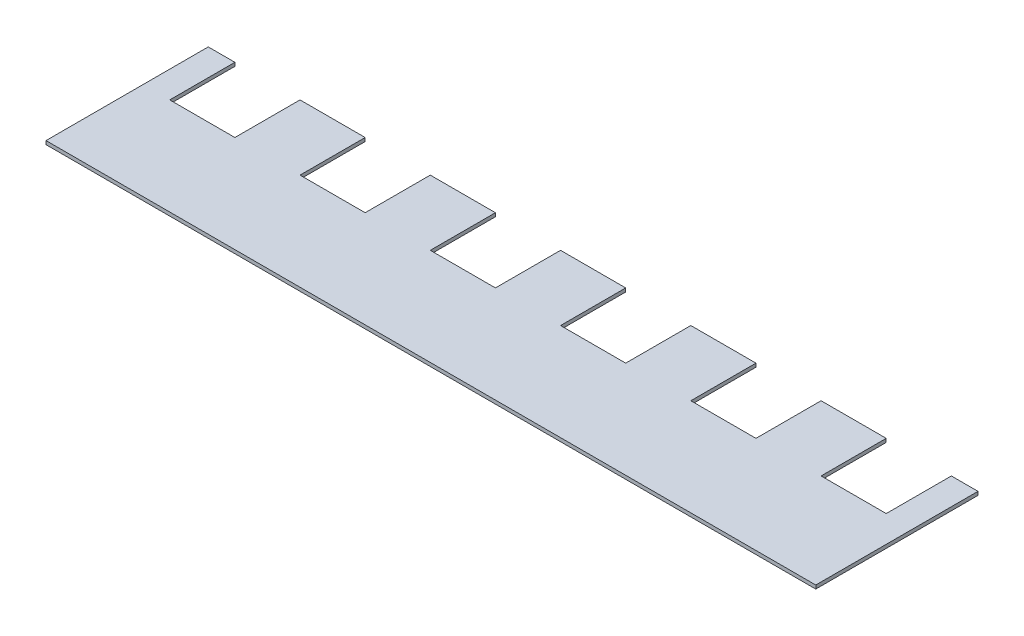
ISO-10303-21;
HEADER;
FILE_DESCRIPTION(('STEP AP214'),'2;1');
FILE_NAME('part.step','',(''),(''),'','','');
FILE_SCHEMA(('AUTOMOTIVE_DESIGN { 1 0 10303 214 1 1 1 1 }'));
ENDSEC;
DATA;
#1=APPLICATION_CONTEXT('core data for automotive mechanical design processes');
#2=APPLICATION_PROTOCOL_DEFINITION('international standard','automotive_design',2000,#1);
#3=PRODUCT_CONTEXT('',#1,'mechanical');
#4=PRODUCT('Part','Part','',(#3));
#5=PRODUCT_RELATED_PRODUCT_CATEGORY('part','',(#4));
#6=PRODUCT_DEFINITION_FORMATION('','',#4);
#7=PRODUCT_DEFINITION_CONTEXT('part definition',#1,'design');
#8=PRODUCT_DEFINITION('design','',#6,#7);
#9=PRODUCT_DEFINITION_SHAPE('','',#8);
#10=(LENGTH_UNIT() NAMED_UNIT(*) SI_UNIT(.MILLI.,.METRE.));
#11=(NAMED_UNIT(*) PLANE_ANGLE_UNIT() SI_UNIT($,.RADIAN.));
#12=(NAMED_UNIT(*) SI_UNIT($,.STERADIAN.) SOLID_ANGLE_UNIT());
#13=UNCERTAINTY_MEASURE_WITH_UNIT(LENGTH_MEASURE(1.E-05),#10,'distance_accuracy_value','');
#14=(GEOMETRIC_REPRESENTATION_CONTEXT(3) GLOBAL_UNCERTAINTY_ASSIGNED_CONTEXT((#13)) GLOBAL_UNIT_ASSIGNED_CONTEXT((#10,
#11,#12)) REPRESENTATION_CONTEXT('',''));
#15=CARTESIAN_POINT('',(0.,0.,0.));
#16=DIRECTION('',(0.,0.,1.));
#17=DIRECTION('',(1.,0.,0.));
#18=AXIS2_PLACEMENT_3D('',#15,#16,#17);
#19=CARTESIAN_POINT('',(-62.5126849362151,3.,-109.983119557904));
#20=DIRECTION('',(0.,0.,-1.));
#21=DIRECTION('',(-1.,0.,0.));
#22=AXIS2_PLACEMENT_3D('',#19,#20,#21);
#23=PLANE('',#22);
#24=DIRECTION('',(0.,1.,0.));
#25=VECTOR('',#24,1.);
#26=CARTESIAN_POINT('',(-40.0126849362151,0.,-109.983119557904));
#27=LINE('',#26,#25);
#28=CARTESIAN_POINT('',(-40.0126849362151,0.,-109.983119557904));
#29=VERTEX_POINT('',#28);
#30=CARTESIAN_POINT('',(-40.0126849362151,3.,-109.983119557904));
#31=VERTEX_POINT('',#30);
#32=EDGE_CURVE('E248',#29,#31,#27,.T.);
#33=ORIENTED_EDGE('',*,*,#32,.F.);
#34=DIRECTION('',(1.,0.,0.));
#35=VECTOR('',#34,1.);
#36=CARTESIAN_POINT('',(-62.5126849362151,0.,-109.983119557904));
#37=LINE('',#36,#35);
#38=CARTESIAN_POINT('',(-62.5126849362151,0.,-109.983119557904));
#39=VERTEX_POINT('',#38);
#40=EDGE_CURVE('E239',#39,#29,#37,.T.);
#41=ORIENTED_EDGE('',*,*,#40,.F.);
#42=DIRECTION('',(0.,-1.,0.));
#43=VECTOR('',#42,1.);
#44=CARTESIAN_POINT('',(-62.5126849362151,3.,-109.983119557904));
#45=LINE('',#44,#43);
#46=CARTESIAN_POINT('',(-62.5126849362151,3.,-109.983119557904));
#47=VERTEX_POINT('',#46);
#48=EDGE_CURVE('E356',#47,#39,#45,.T.);
#49=ORIENTED_EDGE('',*,*,#48,.F.);
#50=DIRECTION('',(1.,0.,0.));
#51=VECTOR('',#50,1.);
#52=CARTESIAN_POINT('',(-62.5126849362151,3.,-109.983119557904));
#53=LINE('',#52,#51);
#54=EDGE_CURVE('E353',#47,#31,#53,.T.);
#55=ORIENTED_EDGE('',*,*,#54,.T.);
#56=EDGE_LOOP('',(#33,#41,#49,#55));
#57=FACE_BOUND('',#56,.T.);
#58=ADVANCED_FACE('F33',(#57),#23,.T.);
#59=CARTESIAN_POINT('',(454.987315063785,0.,-109.983119557904));
#60=VERTEX_POINT('',#59);
#61=CARTESIAN_POINT('',(509.987315063785,0.,-109.983119557904));
#62=VERTEX_POINT('',#61);
#63=EDGE_CURVE('E442',#60,#62,#37,.T.);
#64=ORIENTED_EDGE('',*,*,#63,.F.);
#65=DIRECTION('',(0.,1.,0.));
#66=VECTOR('',#65,1.);
#67=CARTESIAN_POINT('',(454.987315063785,-1.2E-05,-109.983119557904));
#68=LINE('',#67,#66);
#69=CARTESIAN_POINT('',(454.987315063785,3.,-109.983119557904));
#70=VERTEX_POINT('',#69);
#71=EDGE_CURVE('E316',#60,#70,#68,.T.);
#72=ORIENTED_EDGE('',*,*,#71,.T.);
#73=CARTESIAN_POINT('',(509.987315063785,3.,-109.983119557904));
#74=VERTEX_POINT('',#73);
#75=EDGE_CURVE('E438',#70,#74,#53,.T.);
#76=ORIENTED_EDGE('',*,*,#75,.T.);
#77=DIRECTION('',(0.,1.,0.));
#78=VECTOR('',#77,1.);
#79=CARTESIAN_POINT('',(509.987315063785,-1.2E-05,-109.983119557904));
#80=LINE('',#79,#78);
#81=EDGE_CURVE('E302',#62,#74,#80,.T.);
#82=ORIENTED_EDGE('',*,*,#81,.F.);
#83=EDGE_LOOP('',(#64,#72,#76,#82));
#84=FACE_BOUND('',#83,.T.);
#85=ADVANCED_FACE('F440',(#84),#23,.T.);
#86=CARTESIAN_POINT('',(564.987315063785,0.,-109.983119557904));
#87=VERTEX_POINT('',#86);
#88=CARTESIAN_POINT('',(587.487315063785,0.,-109.983119557904));
#89=VERTEX_POINT('',#88);
#90=EDGE_CURVE('E367',#87,#89,#37,.T.);
#91=ORIENTED_EDGE('',*,*,#90,.F.);
#92=DIRECTION('',(0.,1.,0.));
#93=VECTOR('',#92,1.);
#94=CARTESIAN_POINT('',(564.987315063785,-1.2E-05,-109.983119557904));
#95=LINE('',#94,#93);
#96=CARTESIAN_POINT('',(564.987315063785,3.,-109.983119557904));
#97=VERTEX_POINT('',#96);
#98=EDGE_CURVE('E299',#87,#97,#95,.T.);
#99=ORIENTED_EDGE('',*,*,#98,.T.);
#100=CARTESIAN_POINT('',(587.487315063785,3.,-109.983119557904));
#101=VERTEX_POINT('',#100);
#102=EDGE_CURVE('E352',#97,#101,#53,.T.);
#103=ORIENTED_EDGE('',*,*,#102,.T.);
#104=DIRECTION('',(0.,-1.,0.));
#105=VECTOR('',#104,1.);
#106=CARTESIAN_POINT('',(587.487315063785,3.,-109.983119557904));
#107=LINE('',#106,#105);
#108=EDGE_CURVE('E372',#101,#89,#107,.T.);
#109=ORIENTED_EDGE('',*,*,#108,.T.);
#110=EDGE_LOOP('',(#91,#99,#103,#109));
#111=FACE_BOUND('',#110,.T.);
#112=ADVANCED_FACE('F512',(#111),#23,.T.);
#113=CARTESIAN_POINT('',(124.987315063785,0.,-109.983119557904));
#114=VERTEX_POINT('',#113);
#115=CARTESIAN_POINT('',(179.987315063785,0.,-109.983119557904));
#116=VERTEX_POINT('',#115);
#117=EDGE_CURVE('E370',#114,#116,#37,.T.);
#118=ORIENTED_EDGE('',*,*,#117,.F.);
#119=DIRECTION('',(0.,1.,0.));
#120=VECTOR('',#119,1.);
#121=CARTESIAN_POINT('',(124.987315063785,-1.2E-05,-109.983119557904));
#122=LINE('',#121,#120);
#123=CARTESIAN_POINT('',(124.987315063785,3.,-109.983119557904));
#124=VERTEX_POINT('',#123);
#125=EDGE_CURVE('E280',#114,#124,#122,.T.);
#126=ORIENTED_EDGE('',*,*,#125,.T.);
#127=CARTESIAN_POINT('',(179.987315063785,3.,-109.983119557904));
#128=VERTEX_POINT('',#127);
#129=EDGE_CURVE('E358',#124,#128,#53,.T.);
#130=ORIENTED_EDGE('',*,*,#129,.T.);
#131=DIRECTION('',(0.,1.,0.));
#132=VECTOR('',#131,1.);
#133=CARTESIAN_POINT('',(179.987315063785,-1.2E-05,-109.983119557904));
#134=LINE('',#133,#132);
#135=EDGE_CURVE('E263',#116,#128,#134,.T.);
#136=ORIENTED_EDGE('',*,*,#135,.F.);
#137=EDGE_LOOP('',(#118,#126,#130,#136));
#138=FACE_BOUND('',#137,.T.);
#139=ADVANCED_FACE('F484',(#138),#23,.T.);
#140=CARTESIAN_POINT('',(234.987315063785,0.,-109.983119557904));
#141=VERTEX_POINT('',#140);
#142=CARTESIAN_POINT('',(289.987315063785,0.,-109.983119557904));
#143=VERTEX_POINT('',#142);
#144=EDGE_CURVE('E444',#141,#143,#37,.T.);
#145=ORIENTED_EDGE('',*,*,#144,.F.);
#146=DIRECTION('',(0.,1.,0.));
#147=VECTOR('',#146,1.);
#148=CARTESIAN_POINT('',(234.987315063785,-1.2E-05,-109.983119557904));
#149=LINE('',#148,#147);
#150=CARTESIAN_POINT('',(234.987315063785,3.,-109.983119557904));
#151=VERTEX_POINT('',#150);
#152=EDGE_CURVE('E260',#141,#151,#149,.T.);
#153=ORIENTED_EDGE('',*,*,#152,.T.);
#154=CARTESIAN_POINT('',(289.987315063785,3.,-109.983119557904));
#155=VERTEX_POINT('',#154);
#156=EDGE_CURVE('E460',#151,#155,#53,.T.);
#157=ORIENTED_EDGE('',*,*,#156,.T.);
#158=DIRECTION('',(0.,1.,0.));
#159=VECTOR('',#158,1.);
#160=CARTESIAN_POINT('',(289.987315063785,-1.2E-05,-109.983119557904));
#161=LINE('',#160,#159);
#162=EDGE_CURVE('E335',#143,#155,#161,.T.);
#163=ORIENTED_EDGE('',*,*,#162,.F.);
#164=EDGE_LOOP('',(#145,#153,#157,#163));
#165=FACE_BOUND('',#164,.T.);
#166=ADVANCED_FACE('F457',(#165),#23,.T.);
#167=DIRECTION('',(0.,1.,0.));
#168=VECTOR('',#167,1.);
#169=CARTESIAN_POINT('',(399.987315063785,-1.2E-05,-109.983119557904));
#170=LINE('',#169,#168);
#171=CARTESIAN_POINT('',(399.987315063785,0.,-109.983119557904));
#172=VERTEX_POINT('',#171);
#173=CARTESIAN_POINT('',(399.987315063785,3.,-109.983119557904));
#174=VERTEX_POINT('',#173);
#175=EDGE_CURVE('E250',#172,#174,#170,.T.);
#176=ORIENTED_EDGE('',*,*,#175,.F.);
#177=CARTESIAN_POINT('',(344.987315063785,0.,-109.983119557904));
#178=VERTEX_POINT('',#177);
#179=EDGE_CURVE('E443',#178,#172,#37,.T.);
#180=ORIENTED_EDGE('',*,*,#179,.F.);
#181=DIRECTION('',(0.,1.,0.));
#182=VECTOR('',#181,1.);
#183=CARTESIAN_POINT('',(344.987315063785,-1.2E-05,-109.983119557904));
#184=LINE('',#183,#182);
#185=CARTESIAN_POINT('',(344.987315063785,3.,-109.983119557904));
#186=VERTEX_POINT('',#185);
#187=EDGE_CURVE('E338',#178,#186,#184,.T.);
#188=ORIENTED_EDGE('',*,*,#187,.T.);
#189=EDGE_CURVE('E473',#186,#174,#53,.T.);
#190=ORIENTED_EDGE('',*,*,#189,.T.);
#191=EDGE_LOOP('',(#176,#180,#188,#190));
#192=FACE_BOUND('',#191,.T.);
#193=ADVANCED_FACE('F472',(#192),#23,.T.);
#194=CARTESIAN_POINT('',(-62.5126849362151,3.,-109.983119557904));
#195=DIRECTION('',(1.,0.,0.));
#196=DIRECTION('',(0.,0.,-1.));
#197=AXIS2_PLACEMENT_3D('',#194,#195,#196);
#198=PLANE('',#197);
#199=DIRECTION('',(0.,0.,1.));
#200=VECTOR('',#199,1.);
#201=CARTESIAN_POINT('',(-62.5126849362151,0.,-109.983119557904));
#202=LINE('',#201,#200);
#203=CARTESIAN_POINT('',(-62.5126849362151,0.,27.016880442096));
#204=VERTEX_POINT('',#203);
#205=EDGE_CURVE('E337',#39,#204,#202,.T.);
#206=ORIENTED_EDGE('',*,*,#205,.T.);
#207=DIRECTION('',(0.,-1.,0.));
#208=VECTOR('',#207,1.);
#209=CARTESIAN_POINT('',(-62.5126849362151,3.,27.016880442096));
#210=LINE('',#209,#208);
#211=CARTESIAN_POINT('',(-62.5126849362151,3.,27.016880442096));
#212=VERTEX_POINT('',#211);
#213=EDGE_CURVE('E377',#212,#204,#210,.T.);
#214=ORIENTED_EDGE('',*,*,#213,.F.);
#215=DIRECTION('',(0.,0.,1.));
#216=VECTOR('',#215,1.);
#217=CARTESIAN_POINT('',(-62.5126849362151,3.,-109.983119557904));
#218=LINE('',#217,#216);
#219=EDGE_CURVE('E344',#47,#212,#218,.T.);
#220=ORIENTED_EDGE('',*,*,#219,.F.);
#221=ORIENTED_EDGE('',*,*,#48,.T.);
#222=EDGE_LOOP('',(#206,#214,#220,#221));
#223=FACE_BOUND('',#222,.T.);
#224=ADVANCED_FACE('F35',(#223),#198,.F.);
#225=CARTESIAN_POINT('',(-62.5126849362151,3.,27.016880442096));
#226=DIRECTION('',(0.,0.,-1.));
#227=DIRECTION('',(-1.,0.,0.));
#228=AXIS2_PLACEMENT_3D('',#225,#226,#227);
#229=PLANE('',#228);
#230=DIRECTION('',(1.,0.,0.));
#231=VECTOR('',#230,1.);
#232=CARTESIAN_POINT('',(-62.5126849362151,0.,27.016880442096));
#233=LINE('',#232,#231);
#234=CARTESIAN_POINT('',(587.487315063785,0.,27.016880442096));
#235=VERTEX_POINT('',#234);
#236=EDGE_CURVE('E361',#204,#235,#233,.T.);
#237=ORIENTED_EDGE('',*,*,#236,.T.);
#238=DIRECTION('',(0.,-1.,0.));
#239=VECTOR('',#238,1.);
#240=CARTESIAN_POINT('',(587.487315063785,3.,27.016880442096));
#241=LINE('',#240,#239);
#242=CARTESIAN_POINT('',(587.487315063785,3.,27.016880442096));
#243=VERTEX_POINT('',#242);
#244=EDGE_CURVE('E375',#243,#235,#241,.T.);
#245=ORIENTED_EDGE('',*,*,#244,.F.);
#246=DIRECTION('',(1.,0.,0.));
#247=VECTOR('',#246,1.);
#248=CARTESIAN_POINT('',(-62.5126849362151,3.,27.016880442096));
#249=LINE('',#248,#247);
#250=EDGE_CURVE('E347',#212,#243,#249,.T.);
#251=ORIENTED_EDGE('',*,*,#250,.F.);
#252=ORIENTED_EDGE('',*,*,#213,.T.);
#253=EDGE_LOOP('',(#237,#245,#251,#252));
#254=FACE_BOUND('',#253,.T.);
#255=ADVANCED_FACE('F522',(#254),#229,.F.);
#256=CARTESIAN_POINT('',(587.487315063785,3.,-109.983119557904));
#257=DIRECTION('',(1.,0.,0.));
#258=DIRECTION('',(0.,0.,-1.));
#259=AXIS2_PLACEMENT_3D('',#256,#257,#258);
#260=PLANE('',#259);
#261=DIRECTION('',(0.,0.,1.));
#262=VECTOR('',#261,1.);
#263=CARTESIAN_POINT('',(587.487315063785,0.,-109.983119557904));
#264=LINE('',#263,#262);
#265=EDGE_CURVE('E364',#89,#235,#264,.T.);
#266=ORIENTED_EDGE('',*,*,#265,.F.);
#267=ORIENTED_EDGE('',*,*,#108,.F.);
#268=DIRECTION('',(0.,0.,1.));
#269=VECTOR('',#268,1.);
#270=CARTESIAN_POINT('',(587.487315063785,3.,-109.983119557904));
#271=LINE('',#270,#269);
#272=EDGE_CURVE('E349',#101,#243,#271,.T.);
#273=ORIENTED_EDGE('',*,*,#272,.T.);
#274=ORIENTED_EDGE('',*,*,#244,.T.);
#275=EDGE_LOOP('',(#266,#267,#273,#274));
#276=FACE_BOUND('',#275,.T.);
#277=ADVANCED_FACE('F516',(#276),#260,.T.);
#278=DIRECTION('',(0.,1.,0.));
#279=VECTOR('',#278,1.);
#280=CARTESIAN_POINT('',(14.9873150637849,0.,-109.983119557904));
#281=LINE('',#280,#279);
#282=CARTESIAN_POINT('',(14.9873150637849,0.,-109.983119557904));
#283=VERTEX_POINT('',#282);
#284=CARTESIAN_POINT('',(14.9873150637849,3.,-109.983119557904));
#285=VERTEX_POINT('',#284);
#286=EDGE_CURVE('E251',#283,#285,#281,.T.);
#287=ORIENTED_EDGE('',*,*,#286,.T.);
#288=CARTESIAN_POINT('',(69.9873150637849,3.,-109.983119557904));
#289=VERTEX_POINT('',#288);
#290=EDGE_CURVE('E357',#285,#289,#53,.T.);
#291=ORIENTED_EDGE('',*,*,#290,.T.);
#292=DIRECTION('',(0.,1.,0.));
#293=VECTOR('',#292,1.);
#294=CARTESIAN_POINT('',(69.9873150637849,-1.2E-05,-109.983119557904));
#295=LINE('',#294,#293);
#296=CARTESIAN_POINT('',(69.9873150637849,0.,-109.983119557904));
#297=VERTEX_POINT('',#296);
#298=EDGE_CURVE('E283',#297,#289,#295,.T.);
#299=ORIENTED_EDGE('',*,*,#298,.F.);
#300=EDGE_CURVE('E369',#283,#297,#37,.T.);
#301=ORIENTED_EDGE('',*,*,#300,.F.);
#302=EDGE_LOOP('',(#287,#291,#299,#301));
#303=FACE_BOUND('',#302,.T.);
#304=ADVANCED_FACE('F508',(#303),#23,.T.);
#305=CARTESIAN_POINT('',(0.,3.,0.));
#306=DIRECTION('',(0.,1.,0.));
#307=DIRECTION('',(0.,0.,1.));
#308=AXIS2_PLACEMENT_3D('',#305,#306,#307);
#309=PLANE('',#308);
#310=DIRECTION('',(0.,0.,1.));
#311=VECTOR('',#310,1.);
#312=CARTESIAN_POINT('',(-40.0126849362151,3.,-109.983119557904));
#313=LINE('',#312,#311);
#314=CARTESIAN_POINT('',(-40.0126849362151,3.,-54.983119557904));
#315=VERTEX_POINT('',#314);
#316=EDGE_CURVE('E224',#31,#315,#313,.T.);
#317=ORIENTED_EDGE('',*,*,#316,.F.);
#318=ORIENTED_EDGE('',*,*,#54,.F.);
#319=ORIENTED_EDGE('',*,*,#219,.T.);
#320=ORIENTED_EDGE('',*,*,#250,.T.);
#321=ORIENTED_EDGE('',*,*,#272,.F.);
#322=ORIENTED_EDGE('',*,*,#102,.F.);
#323=DIRECTION('',(0.,0.,1.));
#324=VECTOR('',#323,1.);
#325=CARTESIAN_POINT('',(564.987315063785,3.,-109.983119557904));
#326=LINE('',#325,#324);
#327=CARTESIAN_POINT('',(564.987315063785,3.,-54.983119557904));
#328=VERTEX_POINT('',#327);
#329=EDGE_CURVE('E296',#97,#328,#326,.T.);
#330=ORIENTED_EDGE('',*,*,#329,.T.);
#331=DIRECTION('',(1.,0.,0.));
#332=VECTOR('',#331,1.);
#333=CARTESIAN_POINT('',(509.987315063785,3.,-54.983119557904));
#334=LINE('',#333,#332);
#335=CARTESIAN_POINT('',(509.987315063785,3.,-54.983119557904));
#336=VERTEX_POINT('',#335);
#337=EDGE_CURVE('E307',#336,#328,#334,.T.);
#338=ORIENTED_EDGE('',*,*,#337,.F.);
#339=DIRECTION('',(0.,0.,1.));
#340=VECTOR('',#339,1.);
#341=CARTESIAN_POINT('',(509.987315063785,3.,-109.983119557904));
#342=LINE('',#341,#340);
#343=EDGE_CURVE('E286',#74,#336,#342,.T.);
#344=ORIENTED_EDGE('',*,*,#343,.F.);
#345=ORIENTED_EDGE('',*,*,#75,.F.);
#346=DIRECTION('',(0.,0.,1.));
#347=VECTOR('',#346,1.);
#348=CARTESIAN_POINT('',(454.987315063785,3.,-109.983119557904));
#349=LINE('',#348,#347);
#350=CARTESIAN_POINT('',(454.987315063785,3.,-54.983119557904));
#351=VERTEX_POINT('',#350);
#352=EDGE_CURVE('E314',#70,#351,#349,.T.);
#353=ORIENTED_EDGE('',*,*,#352,.T.);
#354=DIRECTION('',(1.,0.,0.));
#355=VECTOR('',#354,1.);
#356=CARTESIAN_POINT('',(399.987315063785,3.,-54.983119557904));
#357=LINE('',#356,#355);
#358=CARTESIAN_POINT('',(399.987315063785,3.,-54.983119557904));
#359=VERTEX_POINT('',#358);
#360=EDGE_CURVE('E322',#359,#351,#357,.T.);
#361=ORIENTED_EDGE('',*,*,#360,.F.);
#362=DIRECTION('',(0.,0.,1.));
#363=VECTOR('',#362,1.);
#364=CARTESIAN_POINT('',(399.987315063785,3.,-109.983119557904));
#365=LINE('',#364,#363);
#366=EDGE_CURVE('E304',#174,#359,#365,.T.);
#367=ORIENTED_EDGE('',*,*,#366,.F.);
#368=ORIENTED_EDGE('',*,*,#189,.F.);
#369=DIRECTION('',(0.,0.,1.));
#370=VECTOR('',#369,1.);
#371=CARTESIAN_POINT('',(344.987315063785,3.,-109.983119557904));
#372=LINE('',#371,#370);
#373=CARTESIAN_POINT('',(344.987315063785,3.,-54.983119557904));
#374=VERTEX_POINT('',#373);
#375=EDGE_CURVE('E331',#186,#374,#372,.T.);
#376=ORIENTED_EDGE('',*,*,#375,.T.);
#377=DIRECTION('',(1.,0.,0.));
#378=VECTOR('',#377,1.);
#379=CARTESIAN_POINT('',(289.987315063785,3.,-54.983119557904));
#380=LINE('',#379,#378);
#381=CARTESIAN_POINT('',(289.987315063785,3.,-54.983119557904));
#382=VERTEX_POINT('',#381);
#383=EDGE_CURVE('E328',#382,#374,#380,.T.);
#384=ORIENTED_EDGE('',*,*,#383,.F.);
#385=DIRECTION('',(0.,0.,1.));
#386=VECTOR('',#385,1.);
#387=CARTESIAN_POINT('',(289.987315063785,3.,-109.983119557904));
#388=LINE('',#387,#386);
#389=EDGE_CURVE('E274',#155,#382,#388,.T.);
#390=ORIENTED_EDGE('',*,*,#389,.F.);
#391=ORIENTED_EDGE('',*,*,#156,.F.);
#392=DIRECTION('',(0.,0.,1.));
#393=VECTOR('',#392,1.);
#394=CARTESIAN_POINT('',(234.987315063785,3.,-109.983119557904));
#395=LINE('',#394,#393);
#396=CARTESIAN_POINT('',(234.987315063785,3.,-54.983119557904));
#397=VERTEX_POINT('',#396);
#398=EDGE_CURVE('E257',#151,#397,#395,.T.);
#399=ORIENTED_EDGE('',*,*,#398,.T.);
#400=DIRECTION('',(1.,0.,0.));
#401=VECTOR('',#400,1.);
#402=CARTESIAN_POINT('',(179.987315063785,3.,-54.983119557904));
#403=LINE('',#402,#401);
#404=CARTESIAN_POINT('',(179.987315063785,3.,-54.983119557904));
#405=VERTEX_POINT('',#404);
#406=EDGE_CURVE('E268',#405,#397,#403,.T.);
#407=ORIENTED_EDGE('',*,*,#406,.F.);
#408=DIRECTION('',(0.,0.,1.));
#409=VECTOR('',#408,1.);
#410=CARTESIAN_POINT('',(179.987315063785,3.,-109.983119557904));
#411=LINE('',#410,#409);
#412=EDGE_CURVE('E271',#128,#405,#411,.T.);
#413=ORIENTED_EDGE('',*,*,#412,.F.);
#414=ORIENTED_EDGE('',*,*,#129,.F.);
#415=DIRECTION('',(0.,0.,1.));
#416=VECTOR('',#415,1.);
#417=CARTESIAN_POINT('',(124.987315063785,3.,-109.983119557904));
#418=LINE('',#417,#416);
#419=CARTESIAN_POINT('',(124.987315063785,3.,-54.983119557904));
#420=VERTEX_POINT('',#419);
#421=EDGE_CURVE('E277',#124,#420,#418,.T.);
#422=ORIENTED_EDGE('',*,*,#421,.T.);
#423=DIRECTION('',(1.,0.,0.));
#424=VECTOR('',#423,1.);
#425=CARTESIAN_POINT('',(69.9873150637849,3.,-54.983119557904));
#426=LINE('',#425,#424);
#427=CARTESIAN_POINT('',(69.9873150637849,3.,-54.983119557904));
#428=VERTEX_POINT('',#427);
#429=EDGE_CURVE('E289',#428,#420,#426,.T.);
#430=ORIENTED_EDGE('',*,*,#429,.F.);
#431=DIRECTION('',(0.,0.,1.));
#432=VECTOR('',#431,1.);
#433=CARTESIAN_POINT('',(69.9873150637849,3.,-109.983119557904));
#434=LINE('',#433,#432);
#435=EDGE_CURVE('E265',#289,#428,#434,.T.);
#436=ORIENTED_EDGE('',*,*,#435,.F.);
#437=ORIENTED_EDGE('',*,*,#290,.F.);
#438=DIRECTION('',(0.,0.,-1.));
#439=VECTOR('',#438,1.);
#440=CARTESIAN_POINT('',(14.9873150637849,3.,-109.983119557904));
#441=LINE('',#440,#439);
#442=CARTESIAN_POINT('',(14.9873150637849,3.,-54.983119557904));
#443=VERTEX_POINT('',#442);
#444=EDGE_CURVE('E240',#443,#285,#441,.T.);
#445=ORIENTED_EDGE('',*,*,#444,.F.);
#446=DIRECTION('',(1.,0.,0.));
#447=VECTOR('',#446,1.);
#448=CARTESIAN_POINT('',(-40.0126849362151,3.,-54.983119557904));
#449=LINE('',#448,#447);
#450=EDGE_CURVE('E242',#315,#443,#449,.T.);
#451=ORIENTED_EDGE('',*,*,#450,.F.);
#452=EDGE_LOOP('',(#317,#318,#319,#320,#321,#322,#330,#338,#344,#345,#353,#361,#367,#368,#376,
#384,#390,#391,#399,#407,#413,#414,#422,#430,#436,#437,#445,#451));
#453=FACE_BOUND('',#452,.T.);
#454=ADVANCED_FACE('F434',(#453),#309,.T.);
#455=CARTESIAN_POINT('',(0.,0.,0.));
#456=DIRECTION('',(0.,1.,0.));
#457=DIRECTION('',(0.,0.,1.));
#458=AXIS2_PLACEMENT_3D('',#455,#456,#457);
#459=PLANE('',#458);
#460=ORIENTED_EDGE('',*,*,#40,.T.);
#461=DIRECTION('',(0.,0.,1.));
#462=VECTOR('',#461,1.);
#463=CARTESIAN_POINT('',(-40.0126849362151,0.,-109.983119557904));
#464=LINE('',#463,#462);
#465=CARTESIAN_POINT('',(-40.0126849362151,0.,-54.983119557904));
#466=VERTEX_POINT('',#465);
#467=EDGE_CURVE('E221',#29,#466,#464,.T.);
#468=ORIENTED_EDGE('',*,*,#467,.T.);
#469=DIRECTION('',(1.,0.,0.));
#470=VECTOR('',#469,1.);
#471=CARTESIAN_POINT('',(-40.0126849362151,0.,-54.983119557904));
#472=LINE('',#471,#470);
#473=CARTESIAN_POINT('',(14.9873150637849,0.,-54.983119557904));
#474=VERTEX_POINT('',#473);
#475=EDGE_CURVE('E231',#466,#474,#472,.T.);
#476=ORIENTED_EDGE('',*,*,#475,.T.);
#477=DIRECTION('',(0.,0.,-1.));
#478=VECTOR('',#477,1.);
#479=CARTESIAN_POINT('',(14.9873150637849,0.,-109.983119557904));
#480=LINE('',#479,#478);
#481=EDGE_CURVE('E48',#474,#283,#480,.T.);
#482=ORIENTED_EDGE('',*,*,#481,.T.);
#483=ORIENTED_EDGE('',*,*,#300,.T.);
#484=DIRECTION('',(0.,0.,1.));
#485=VECTOR('',#484,1.);
#486=CARTESIAN_POINT('',(69.9873150637849,0.,0.));
#487=LINE('',#486,#485);
#488=CARTESIAN_POINT('',(69.9873150637849,0.,-54.983119557904));
#489=VERTEX_POINT('',#488);
#490=EDGE_CURVE('E404',#297,#489,#487,.T.);
#491=ORIENTED_EDGE('',*,*,#490,.T.);
#492=DIRECTION('',(1.,0.,0.));
#493=VECTOR('',#492,1.);
#494=CARTESIAN_POINT('',(0.,0.,-54.983119557904));
#495=LINE('',#494,#493);
#496=CARTESIAN_POINT('',(124.987315063785,0.,-54.983119557904));
#497=VERTEX_POINT('',#496);
#498=EDGE_CURVE('E398',#489,#497,#495,.T.);
#499=ORIENTED_EDGE('',*,*,#498,.T.);
#500=DIRECTION('',(0.,0.,1.));
#501=VECTOR('',#500,1.);
#502=CARTESIAN_POINT('',(124.987315063785,0.,0.));
#503=LINE('',#502,#501);
#504=EDGE_CURVE('E401',#114,#497,#503,.T.);
#505=ORIENTED_EDGE('',*,*,#504,.F.);
#506=ORIENTED_EDGE('',*,*,#117,.T.);
#507=DIRECTION('',(0.,0.,1.));
#508=VECTOR('',#507,1.);
#509=CARTESIAN_POINT('',(179.987315063785,0.,0.));
#510=LINE('',#509,#508);
#511=CARTESIAN_POINT('',(179.987315063785,0.,-54.983119557904));
#512=VERTEX_POINT('',#511);
#513=EDGE_CURVE('E395',#116,#512,#510,.T.);
#514=ORIENTED_EDGE('',*,*,#513,.T.);
#515=DIRECTION('',(1.,0.,0.));
#516=VECTOR('',#515,1.);
#517=CARTESIAN_POINT('',(0.,0.,-54.983119557904));
#518=LINE('',#517,#516);
#519=CARTESIAN_POINT('',(234.987315063785,0.,-54.983119557904));
#520=VERTEX_POINT('',#519);
#521=EDGE_CURVE('E389',#512,#520,#518,.T.);
#522=ORIENTED_EDGE('',*,*,#521,.T.);
#523=DIRECTION('',(0.,0.,1.));
#524=VECTOR('',#523,1.);
#525=CARTESIAN_POINT('',(234.987315063785,0.,0.));
#526=LINE('',#525,#524);
#527=EDGE_CURVE('E392',#141,#520,#526,.T.);
#528=ORIENTED_EDGE('',*,*,#527,.F.);
#529=ORIENTED_EDGE('',*,*,#144,.T.);
#530=DIRECTION('',(0.,0.,1.));
#531=VECTOR('',#530,1.);
#532=CARTESIAN_POINT('',(289.987315063785,0.,0.));
#533=LINE('',#532,#531);
#534=CARTESIAN_POINT('',(289.987315063785,0.,-54.983119557904));
#535=VERTEX_POINT('',#534);
#536=EDGE_CURVE('E386',#143,#535,#533,.T.);
#537=ORIENTED_EDGE('',*,*,#536,.T.);
#538=DIRECTION('',(1.,0.,0.));
#539=VECTOR('',#538,1.);
#540=CARTESIAN_POINT('',(0.,0.,-54.983119557904));
#541=LINE('',#540,#539);
#542=CARTESIAN_POINT('',(344.987315063785,0.,-54.983119557904));
#543=VERTEX_POINT('',#542);
#544=EDGE_CURVE('E380',#535,#543,#541,.T.);
#545=ORIENTED_EDGE('',*,*,#544,.T.);
#546=DIRECTION('',(0.,0.,1.));
#547=VECTOR('',#546,1.);
#548=CARTESIAN_POINT('',(344.987315063785,0.,0.));
#549=LINE('',#548,#547);
#550=EDGE_CURVE('E383',#178,#543,#549,.T.);
#551=ORIENTED_EDGE('',*,*,#550,.F.);
#552=ORIENTED_EDGE('',*,*,#179,.T.);
#553=DIRECTION('',(0.,0.,1.));
#554=VECTOR('',#553,1.);
#555=CARTESIAN_POINT('',(399.987315063785,0.,0.));
#556=LINE('',#555,#554);
#557=CARTESIAN_POINT('',(399.987315063785,0.,-54.983119557904));
#558=VERTEX_POINT('',#557);
#559=EDGE_CURVE('E11',#172,#558,#556,.T.);
#560=ORIENTED_EDGE('',*,*,#559,.T.);
#561=DIRECTION('',(1.,0.,0.));
#562=VECTOR('',#561,1.);
#563=CARTESIAN_POINT('',(0.,0.,-54.983119557904));
#564=LINE('',#563,#562);
#565=CARTESIAN_POINT('',(454.987315063785,0.,-54.983119557904));
#566=VERTEX_POINT('',#565);
#567=EDGE_CURVE('E416',#558,#566,#564,.T.);
#568=ORIENTED_EDGE('',*,*,#567,.T.);
#569=DIRECTION('',(0.,0.,1.));
#570=VECTOR('',#569,1.);
#571=CARTESIAN_POINT('',(454.987315063785,0.,0.));
#572=LINE('',#571,#570);
#573=EDGE_CURVE('E41',#60,#566,#572,.T.);
#574=ORIENTED_EDGE('',*,*,#573,.F.);
#575=ORIENTED_EDGE('',*,*,#63,.T.);
#576=DIRECTION('',(0.,0.,1.));
#577=VECTOR('',#576,1.);
#578=CARTESIAN_POINT('',(509.987315063785,0.,0.));
#579=LINE('',#578,#577);
#580=CARTESIAN_POINT('',(509.987315063785,0.,-54.983119557904));
#581=VERTEX_POINT('',#580);
#582=EDGE_CURVE('E413',#62,#581,#579,.T.);
#583=ORIENTED_EDGE('',*,*,#582,.T.);
#584=DIRECTION('',(1.,0.,0.));
#585=VECTOR('',#584,1.);
#586=CARTESIAN_POINT('',(0.,0.,-54.983119557904));
#587=LINE('',#586,#585);
#588=CARTESIAN_POINT('',(564.987315063785,0.,-54.983119557904));
#589=VERTEX_POINT('',#588);
#590=EDGE_CURVE('E407',#581,#589,#587,.T.);
#591=ORIENTED_EDGE('',*,*,#590,.T.);
#592=DIRECTION('',(0.,0.,1.));
#593=VECTOR('',#592,1.);
#594=CARTESIAN_POINT('',(564.987315063785,0.,0.));
#595=LINE('',#594,#593);
#596=EDGE_CURVE('E410',#87,#589,#595,.T.);
#597=ORIENTED_EDGE('',*,*,#596,.F.);
#598=ORIENTED_EDGE('',*,*,#90,.T.);
#599=ORIENTED_EDGE('',*,*,#265,.T.);
#600=ORIENTED_EDGE('',*,*,#236,.F.);
#601=ORIENTED_EDGE('',*,*,#205,.F.);
#602=EDGE_LOOP('',(#460,#468,#476,#482,#483,#491,#499,#505,#506,#514,#522,#528,#529,#537,#545,
#551,#552,#560,#568,#574,#575,#583,#591,#597,#598,#599,#600,#601));
#603=FACE_BOUND('',#602,.T.);
#604=ADVANCED_FACE('F236',(#603),#459,.F.);
#605=CARTESIAN_POINT('',(289.987315063785,-1.2E-05,-109.983119557904));
#606=DIRECTION('',(-1.,0.,0.));
#607=DIRECTION('',(0.,0.,1.));
#608=AXIS2_PLACEMENT_3D('',#605,#606,#607);
#609=PLANE('',#608);
#610=ORIENTED_EDGE('',*,*,#162,.T.);
#611=ORIENTED_EDGE('',*,*,#389,.T.);
#612=DIRECTION('',(0.,1.,0.));
#613=VECTOR('',#612,1.);
#614=CARTESIAN_POINT('',(289.987315063785,-1.2E-05,-54.983119557904));
#615=LINE('',#614,#613);
#616=EDGE_CURVE('E334',#535,#382,#615,.T.);
#617=ORIENTED_EDGE('',*,*,#616,.F.);
#618=ORIENTED_EDGE('',*,*,#536,.F.);
#619=EDGE_LOOP('',(#610,#611,#617,#618));
#620=FACE_BOUND('',#619,.T.);
#621=ADVANCED_FACE('F463',(#620),#609,.F.);
#622=CARTESIAN_POINT('',(344.987315063785,-1.2E-05,-109.983119557904));
#623=DIRECTION('',(-1.,0.,0.));
#624=DIRECTION('',(0.,0.,1.));
#625=AXIS2_PLACEMENT_3D('',#622,#623,#624);
#626=PLANE('',#625);
#627=ORIENTED_EDGE('',*,*,#550,.T.);
#628=DIRECTION('',(0.,1.,0.));
#629=VECTOR('',#628,1.);
#630=CARTESIAN_POINT('',(344.987315063785,-1.2E-05,-54.983119557904));
#631=LINE('',#630,#629);
#632=EDGE_CURVE('E341',#543,#374,#631,.T.);
#633=ORIENTED_EDGE('',*,*,#632,.T.);
#634=ORIENTED_EDGE('',*,*,#375,.F.);
#635=ORIENTED_EDGE('',*,*,#187,.F.);
#636=EDGE_LOOP('',(#627,#633,#634,#635));
#637=FACE_BOUND('',#636,.T.);
#638=ADVANCED_FACE('F580',(#637),#626,.T.);
#639=CARTESIAN_POINT('',(289.987315063785,-1.2E-05,-54.983119557904));
#640=DIRECTION('',(0.,0.,1.));
#641=DIRECTION('',(1.,0.,0.));
#642=AXIS2_PLACEMENT_3D('',#639,#640,#641);
#643=PLANE('',#642);
#644=ORIENTED_EDGE('',*,*,#616,.T.);
#645=ORIENTED_EDGE('',*,*,#383,.T.);
#646=ORIENTED_EDGE('',*,*,#632,.F.);
#647=ORIENTED_EDGE('',*,*,#544,.F.);
#648=EDGE_LOOP('',(#644,#645,#646,#647));
#649=FACE_BOUND('',#648,.T.);
#650=ADVANCED_FACE('F467',(#649),#643,.F.);
#651=CARTESIAN_POINT('',(179.987315063785,-1.2E-05,-109.983119557904));
#652=DIRECTION('',(-1.,0.,0.));
#653=DIRECTION('',(0.,0.,1.));
#654=AXIS2_PLACEMENT_3D('',#651,#652,#653);
#655=PLANE('',#654);
#656=ORIENTED_EDGE('',*,*,#135,.T.);
#657=ORIENTED_EDGE('',*,*,#412,.T.);
#658=DIRECTION('',(0.,1.,0.));
#659=VECTOR('',#658,1.);
#660=CARTESIAN_POINT('',(179.987315063785,-1.2E-05,-54.983119557904));
#661=LINE('',#660,#659);
#662=EDGE_CURVE('E255',#512,#405,#661,.T.);
#663=ORIENTED_EDGE('',*,*,#662,.F.);
#664=ORIENTED_EDGE('',*,*,#513,.F.);
#665=EDGE_LOOP('',(#656,#657,#663,#664));
#666=FACE_BOUND('',#665,.T.);
#667=ADVANCED_FACE('F490',(#666),#655,.F.);
#668=CARTESIAN_POINT('',(234.987315063785,-1.2E-05,-109.983119557904));
#669=DIRECTION('',(-1.,0.,0.));
#670=DIRECTION('',(0.,0.,1.));
#671=AXIS2_PLACEMENT_3D('',#668,#669,#670);
#672=PLANE('',#671);
#673=ORIENTED_EDGE('',*,*,#527,.T.);
#674=DIRECTION('',(0.,1.,0.));
#675=VECTOR('',#674,1.);
#676=CARTESIAN_POINT('',(234.987315063785,-1.2E-05,-54.983119557904));
#677=LINE('',#676,#675);
#678=EDGE_CURVE('E258',#520,#397,#677,.T.);
#679=ORIENTED_EDGE('',*,*,#678,.T.);
#680=ORIENTED_EDGE('',*,*,#398,.F.);
#681=ORIENTED_EDGE('',*,*,#152,.F.);
#682=EDGE_LOOP('',(#673,#679,#680,#681));
#683=FACE_BOUND('',#682,.T.);
#684=ADVANCED_FACE('F494',(#683),#672,.T.);
#685=CARTESIAN_POINT('',(179.987315063785,-1.2E-05,-54.983119557904));
#686=DIRECTION('',(0.,0.,1.));
#687=DIRECTION('',(1.,0.,0.));
#688=AXIS2_PLACEMENT_3D('',#685,#686,#687);
#689=PLANE('',#688);
#690=ORIENTED_EDGE('',*,*,#662,.T.);
#691=ORIENTED_EDGE('',*,*,#406,.T.);
#692=ORIENTED_EDGE('',*,*,#678,.F.);
#693=ORIENTED_EDGE('',*,*,#521,.F.);
#694=EDGE_LOOP('',(#690,#691,#692,#693));
#695=FACE_BOUND('',#694,.T.);
#696=ADVANCED_FACE('F492',(#695),#689,.F.);
#697=CARTESIAN_POINT('',(69.9873150637849,-1.2E-05,-109.983119557904));
#698=DIRECTION('',(-1.,0.,0.));
#699=DIRECTION('',(0.,0.,1.));
#700=AXIS2_PLACEMENT_3D('',#697,#698,#699);
#701=PLANE('',#700);
#702=ORIENTED_EDGE('',*,*,#298,.T.);
#703=ORIENTED_EDGE('',*,*,#435,.T.);
#704=DIRECTION('',(0.,1.,0.));
#705=VECTOR('',#704,1.);
#706=CARTESIAN_POINT('',(69.9873150637849,-1.2E-05,-54.983119557904));
#707=LINE('',#706,#705);
#708=EDGE_CURVE('E275',#489,#428,#707,.T.);
#709=ORIENTED_EDGE('',*,*,#708,.F.);
#710=ORIENTED_EDGE('',*,*,#490,.F.);
#711=EDGE_LOOP('',(#702,#703,#709,#710));
#712=FACE_BOUND('',#711,.T.);
#713=ADVANCED_FACE('F501',(#712),#701,.F.);
#714=CARTESIAN_POINT('',(124.987315063785,-1.2E-05,-109.983119557904));
#715=DIRECTION('',(-1.,0.,0.));
#716=DIRECTION('',(0.,0.,1.));
#717=AXIS2_PLACEMENT_3D('',#714,#715,#716);
#718=PLANE('',#717);
#719=ORIENTED_EDGE('',*,*,#504,.T.);
#720=DIRECTION('',(0.,1.,0.));
#721=VECTOR('',#720,1.);
#722=CARTESIAN_POINT('',(124.987315063785,-1.2E-05,-54.983119557904));
#723=LINE('',#722,#721);
#724=EDGE_CURVE('E278',#497,#420,#723,.T.);
#725=ORIENTED_EDGE('',*,*,#724,.T.);
#726=ORIENTED_EDGE('',*,*,#421,.F.);
#727=ORIENTED_EDGE('',*,*,#125,.F.);
#728=EDGE_LOOP('',(#719,#725,#726,#727));
#729=FACE_BOUND('',#728,.T.);
#730=ADVANCED_FACE('F553',(#729),#718,.T.);
#731=CARTESIAN_POINT('',(69.9873150637849,-1.2E-05,-54.983119557904));
#732=DIRECTION('',(0.,0.,1.));
#733=DIRECTION('',(1.,0.,0.));
#734=AXIS2_PLACEMENT_3D('',#731,#732,#733);
#735=PLANE('',#734);
#736=ORIENTED_EDGE('',*,*,#708,.T.);
#737=ORIENTED_EDGE('',*,*,#429,.T.);
#738=ORIENTED_EDGE('',*,*,#724,.F.);
#739=ORIENTED_EDGE('',*,*,#498,.F.);
#740=EDGE_LOOP('',(#736,#737,#738,#739));
#741=FACE_BOUND('',#740,.T.);
#742=ADVANCED_FACE('F551',(#741),#735,.F.);
#743=CARTESIAN_POINT('',(509.987315063785,-1.2E-05,-109.983119557904));
#744=DIRECTION('',(-1.,0.,0.));
#745=DIRECTION('',(0.,0.,1.));
#746=AXIS2_PLACEMENT_3D('',#743,#744,#745);
#747=PLANE('',#746);
#748=ORIENTED_EDGE('',*,*,#81,.T.);
#749=ORIENTED_EDGE('',*,*,#343,.T.);
#750=DIRECTION('',(0.,1.,0.));
#751=VECTOR('',#750,1.);
#752=CARTESIAN_POINT('',(509.987315063785,-1.2E-05,-54.983119557904));
#753=LINE('',#752,#751);
#754=EDGE_CURVE('E294',#581,#336,#753,.T.);
#755=ORIENTED_EDGE('',*,*,#754,.F.);
#756=ORIENTED_EDGE('',*,*,#582,.F.);
#757=EDGE_LOOP('',(#748,#749,#755,#756));
#758=FACE_BOUND('',#757,.T.);
#759=ADVANCED_FACE('F560',(#758),#747,.F.);
#760=CARTESIAN_POINT('',(564.987315063785,-1.2E-05,-109.983119557904));
#761=DIRECTION('',(-1.,0.,0.));
#762=DIRECTION('',(0.,0.,1.));
#763=AXIS2_PLACEMENT_3D('',#760,#761,#762);
#764=PLANE('',#763);
#765=ORIENTED_EDGE('',*,*,#596,.T.);
#766=DIRECTION('',(0.,1.,0.));
#767=VECTOR('',#766,1.);
#768=CARTESIAN_POINT('',(564.987315063785,-1.2E-05,-54.983119557904));
#769=LINE('',#768,#767);
#770=EDGE_CURVE('E297',#589,#328,#769,.T.);
#771=ORIENTED_EDGE('',*,*,#770,.T.);
#772=ORIENTED_EDGE('',*,*,#329,.F.);
#773=ORIENTED_EDGE('',*,*,#98,.F.);
#774=EDGE_LOOP('',(#765,#771,#772,#773));
#775=FACE_BOUND('',#774,.T.);
#776=ADVANCED_FACE('F565',(#775),#764,.T.);
#777=CARTESIAN_POINT('',(509.987315063785,-1.2E-05,-54.983119557904));
#778=DIRECTION('',(0.,0.,1.));
#779=DIRECTION('',(1.,0.,0.));
#780=AXIS2_PLACEMENT_3D('',#777,#778,#779);
#781=PLANE('',#780);
#782=ORIENTED_EDGE('',*,*,#754,.T.);
#783=ORIENTED_EDGE('',*,*,#337,.T.);
#784=ORIENTED_EDGE('',*,*,#770,.F.);
#785=ORIENTED_EDGE('',*,*,#590,.F.);
#786=EDGE_LOOP('',(#782,#783,#784,#785));
#787=FACE_BOUND('',#786,.T.);
#788=ADVANCED_FACE('F567',(#787),#781,.F.);
#789=CARTESIAN_POINT('',(399.987315063785,-1.2E-05,-109.983119557904));
#790=DIRECTION('',(-1.,0.,0.));
#791=DIRECTION('',(0.,0.,1.));
#792=AXIS2_PLACEMENT_3D('',#789,#790,#791);
#793=PLANE('',#792);
#794=ORIENTED_EDGE('',*,*,#175,.T.);
#795=ORIENTED_EDGE('',*,*,#366,.T.);
#796=DIRECTION('',(0.,1.,0.));
#797=VECTOR('',#796,1.);
#798=CARTESIAN_POINT('',(399.987315063785,-1.2E-05,-54.983119557904));
#799=LINE('',#798,#797);
#800=EDGE_CURVE('E312',#558,#359,#799,.T.);
#801=ORIENTED_EDGE('',*,*,#800,.F.);
#802=ORIENTED_EDGE('',*,*,#559,.F.);
#803=EDGE_LOOP('',(#794,#795,#801,#802));
#804=FACE_BOUND('',#803,.T.);
#805=ADVANCED_FACE('F427',(#804),#793,.F.);
#806=CARTESIAN_POINT('',(454.987315063785,-1.2E-05,-109.983119557904));
#807=DIRECTION('',(-1.,0.,0.));
#808=DIRECTION('',(0.,0.,1.));
#809=AXIS2_PLACEMENT_3D('',#806,#807,#808);
#810=PLANE('',#809);
#811=ORIENTED_EDGE('',*,*,#573,.T.);
#812=DIRECTION('',(0.,1.,0.));
#813=VECTOR('',#812,1.);
#814=CARTESIAN_POINT('',(454.987315063785,-1.2E-05,-54.983119557904));
#815=LINE('',#814,#813);
#816=EDGE_CURVE('E56',#566,#351,#815,.T.);
#817=ORIENTED_EDGE('',*,*,#816,.T.);
#818=ORIENTED_EDGE('',*,*,#352,.F.);
#819=ORIENTED_EDGE('',*,*,#71,.F.);
#820=EDGE_LOOP('',(#811,#817,#818,#819));
#821=FACE_BOUND('',#820,.T.);
#822=ADVANCED_FACE('F420',(#821),#810,.T.);
#823=CARTESIAN_POINT('',(399.987315063785,-1.2E-05,-54.983119557904));
#824=DIRECTION('',(0.,0.,1.));
#825=DIRECTION('',(1.,0.,0.));
#826=AXIS2_PLACEMENT_3D('',#823,#824,#825);
#827=PLANE('',#826);
#828=ORIENTED_EDGE('',*,*,#800,.T.);
#829=ORIENTED_EDGE('',*,*,#360,.T.);
#830=ORIENTED_EDGE('',*,*,#816,.F.);
#831=ORIENTED_EDGE('',*,*,#567,.F.);
#832=EDGE_LOOP('',(#828,#829,#830,#831));
#833=FACE_BOUND('',#832,.T.);
#834=ADVANCED_FACE('F425',(#833),#827,.F.);
#835=CARTESIAN_POINT('',(-40.0126849362151,0.,-109.983119557904));
#836=DIRECTION('',(-1.,0.,0.));
#837=DIRECTION('',(0.,0.,1.));
#838=AXIS2_PLACEMENT_3D('',#835,#836,#837);
#839=PLANE('',#838);
#840=ORIENTED_EDGE('',*,*,#316,.T.);
#841=DIRECTION('',(0.,1.,0.));
#842=VECTOR('',#841,1.);
#843=CARTESIAN_POINT('',(-40.0126849362151,0.,-54.983119557904));
#844=LINE('',#843,#842);
#845=EDGE_CURVE('E217',#466,#315,#844,.T.);
#846=ORIENTED_EDGE('',*,*,#845,.F.);
#847=ORIENTED_EDGE('',*,*,#467,.F.);
#848=ORIENTED_EDGE('',*,*,#32,.T.);
#849=EDGE_LOOP('',(#840,#846,#847,#848));
#850=FACE_BOUND('',#849,.T.);
#851=ADVANCED_FACE('F219',(#850),#839,.F.);
#852=CARTESIAN_POINT('',(14.9873150637849,0.,-109.983119557904));
#853=DIRECTION('',(1.,0.,0.));
#854=DIRECTION('',(0.,0.,-1.));
#855=AXIS2_PLACEMENT_3D('',#852,#853,#854);
#856=PLANE('',#855);
#857=ORIENTED_EDGE('',*,*,#444,.T.);
#858=ORIENTED_EDGE('',*,*,#286,.F.);
#859=ORIENTED_EDGE('',*,*,#481,.F.);
#860=DIRECTION('',(0.,1.,0.));
#861=VECTOR('',#860,1.);
#862=CARTESIAN_POINT('',(14.9873150637849,0.,-54.983119557904));
#863=LINE('',#862,#861);
#864=EDGE_CURVE('E228',#474,#443,#863,.T.);
#865=ORIENTED_EDGE('',*,*,#864,.T.);
#866=EDGE_LOOP('',(#857,#858,#859,#865));
#867=FACE_BOUND('',#866,.T.);
#868=ADVANCED_FACE('F547',(#867),#856,.F.);
#869=CARTESIAN_POINT('',(-40.0126849362151,0.,-54.983119557904));
#870=DIRECTION('',(0.,0.,1.));
#871=DIRECTION('',(1.,0.,0.));
#872=AXIS2_PLACEMENT_3D('',#869,#870,#871);
#873=PLANE('',#872);
#874=ORIENTED_EDGE('',*,*,#450,.T.);
#875=ORIENTED_EDGE('',*,*,#864,.F.);
#876=ORIENTED_EDGE('',*,*,#475,.F.);
#877=ORIENTED_EDGE('',*,*,#845,.T.);
#878=EDGE_LOOP('',(#874,#875,#876,#877));
#879=FACE_BOUND('',#878,.T.);
#880=ADVANCED_FACE('F232',(#879),#873,.F.);
#881=CLOSED_SHELL('',(#58,#85,#112,#139,#166,#193,#224,#255,#277,#304,#454,#604,#621,#638,#650,
#667,#684,#696,#713,#730,#742,#759,#776,#788,#805,#822,#834,#851,#868,#880));
#882=MANIFOLD_SOLID_BREP('B2',#881);
#883=ADVANCED_BREP_SHAPE_REPRESENTATION('',(#18,#882),#14);
#884=SHAPE_DEFINITION_REPRESENTATION(#9,#883);
ENDSEC;
END-ISO-10303-21;
